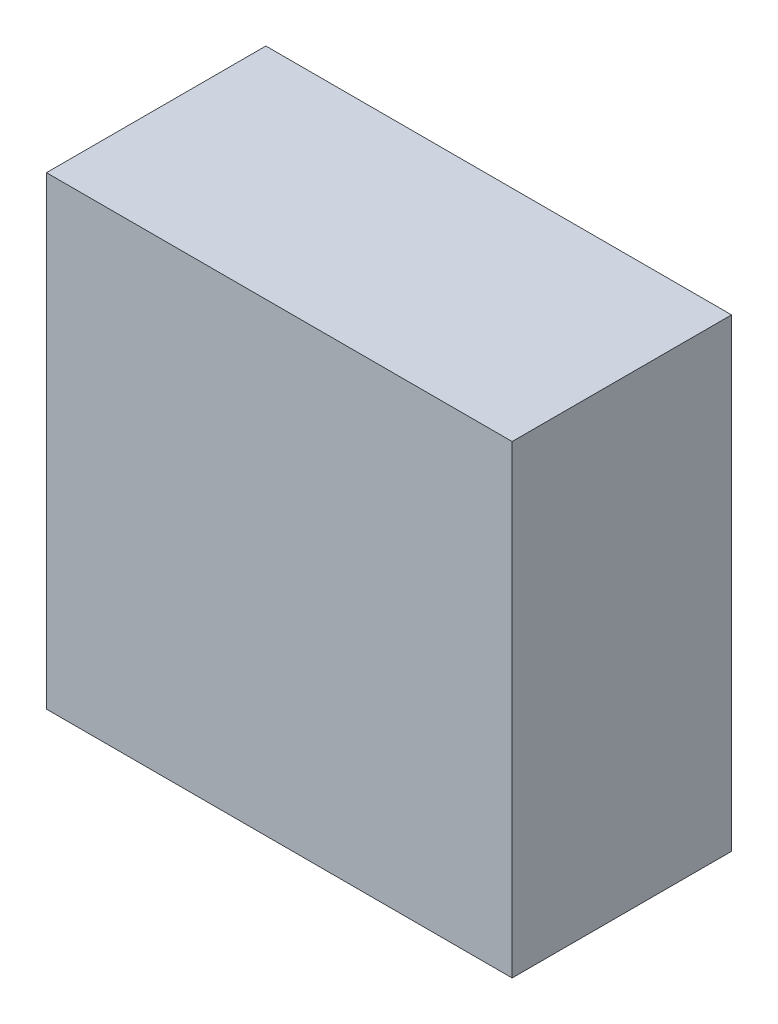
ISO-10303-21;
HEADER;
FILE_DESCRIPTION(('STEP AP214'),'2;1');
FILE_NAME('part.step','',(''),(''),'','','');
FILE_SCHEMA(('AUTOMOTIVE_DESIGN { 1 0 10303 214 1 1 1 1 }'));
ENDSEC;
DATA;
#1=APPLICATION_CONTEXT('core data for automotive mechanical design processes');
#2=APPLICATION_PROTOCOL_DEFINITION('international standard','automotive_design',2000,#1);
#3=PRODUCT_CONTEXT('',#1,'mechanical');
#4=PRODUCT('Part','Part','',(#3));
#5=PRODUCT_RELATED_PRODUCT_CATEGORY('part','',(#4));
#6=PRODUCT_DEFINITION_FORMATION('','',#4);
#7=PRODUCT_DEFINITION_CONTEXT('part definition',#1,'design');
#8=PRODUCT_DEFINITION('design','',#6,#7);
#9=PRODUCT_DEFINITION_SHAPE('','',#8);
#10=(LENGTH_UNIT() NAMED_UNIT(*) SI_UNIT(.MILLI.,.METRE.));
#11=(NAMED_UNIT(*) PLANE_ANGLE_UNIT() SI_UNIT($,.RADIAN.));
#12=(NAMED_UNIT(*) SI_UNIT($,.STERADIAN.) SOLID_ANGLE_UNIT());
#13=UNCERTAINTY_MEASURE_WITH_UNIT(LENGTH_MEASURE(1.E-05),#10,'distance_accuracy_value','');
#14=(GEOMETRIC_REPRESENTATION_CONTEXT(3) GLOBAL_UNCERTAINTY_ASSIGNED_CONTEXT((#13)) GLOBAL_UNIT_ASSIGNED_CONTEXT((#10,
#11,#12)) REPRESENTATION_CONTEXT('',''));
#15=CARTESIAN_POINT('',(0.,0.,0.));
#16=DIRECTION('',(0.,0.,1.));
#17=DIRECTION('',(1.,0.,0.));
#18=AXIS2_PLACEMENT_3D('',#15,#16,#17);
#19=CARTESIAN_POINT('',(-1.106566,-1.1016,1.));
#20=DIRECTION('',(1.,0.,0.));
#21=DIRECTION('',(0.,0.,-1.));
#22=AXIS2_PLACEMENT_3D('',#19,#20,#21);
#23=PLANE('',#22);
#24=DIRECTION('',(0.,-1.,0.));
#25=VECTOR('',#24,1.);
#26=CARTESIAN_POINT('',(-1.106566,-1.1016,0.));
#27=LINE('',#26,#25);
#28=CARTESIAN_POINT('',(-1.106566,1.016,0.));
#29=VERTEX_POINT('',#28);
#30=CARTESIAN_POINT('',(-1.106566,-1.1016,0.));
#31=VERTEX_POINT('',#30);
#32=EDGE_CURVE('E95',#29,#31,#27,.T.);
#33=ORIENTED_EDGE('',*,*,#32,.T.);
#34=DIRECTION('',(0.,0.,-1.));
#35=VECTOR('',#34,1.);
#36=CARTESIAN_POINT('',(-1.106566,-1.1016,1.));
#37=LINE('',#36,#35);
#38=CARTESIAN_POINT('',(-1.106566,-1.1016,1.));
#39=VERTEX_POINT('',#38);
#40=EDGE_CURVE('E11',#39,#31,#37,.T.);
#41=ORIENTED_EDGE('',*,*,#40,.F.);
#42=DIRECTION('',(0.,-1.,0.));
#43=VECTOR('',#42,1.);
#44=CARTESIAN_POINT('',(-1.106566,-1.1016,1.));
#45=LINE('',#44,#43);
#46=CARTESIAN_POINT('',(-1.106566,1.016,1.));
#47=VERTEX_POINT('',#46);
#48=EDGE_CURVE('E83',#47,#39,#45,.T.);
#49=ORIENTED_EDGE('',*,*,#48,.F.);
#50=DIRECTION('',(0.,0.,-1.));
#51=VECTOR('',#50,1.);
#52=CARTESIAN_POINT('',(-1.106566,1.016,1.));
#53=LINE('',#52,#51);
#54=EDGE_CURVE('E91',#47,#29,#53,.T.);
#55=ORIENTED_EDGE('',*,*,#54,.T.);
#56=EDGE_LOOP('',(#33,#41,#49,#55));
#57=FACE_BOUND('',#56,.T.);
#58=ADVANCED_FACE('F32',(#57),#23,.F.);
#59=CARTESIAN_POINT('',(1.016,-1.1016,1.));
#60=DIRECTION('',(0.,1.,0.));
#61=DIRECTION('',(0.,0.,1.));
#62=AXIS2_PLACEMENT_3D('',#59,#60,#61);
#63=PLANE('',#62);
#64=DIRECTION('',(1.,0.,0.));
#65=VECTOR('',#64,1.);
#66=CARTESIAN_POINT('',(1.016,-1.1016,0.));
#67=LINE('',#66,#65);
#68=CARTESIAN_POINT('',(1.016,-1.1016,0.));
#69=VERTEX_POINT('',#68);
#70=EDGE_CURVE('E87',#31,#69,#67,.T.);
#71=ORIENTED_EDGE('',*,*,#70,.T.);
#72=DIRECTION('',(0.,0.,-1.));
#73=VECTOR('',#72,1.);
#74=CARTESIAN_POINT('',(1.016,-1.1016,1.));
#75=LINE('',#74,#73);
#76=CARTESIAN_POINT('',(1.016,-1.1016,1.));
#77=VERTEX_POINT('',#76);
#78=EDGE_CURVE('E40',#77,#69,#75,.T.);
#79=ORIENTED_EDGE('',*,*,#78,.F.);
#80=DIRECTION('',(1.,0.,0.));
#81=VECTOR('',#80,1.);
#82=CARTESIAN_POINT('',(1.016,-1.1016,1.));
#83=LINE('',#82,#81);
#84=EDGE_CURVE('E78',#39,#77,#83,.T.);
#85=ORIENTED_EDGE('',*,*,#84,.F.);
#86=ORIENTED_EDGE('',*,*,#40,.T.);
#87=EDGE_LOOP('',(#71,#79,#85,#86));
#88=FACE_BOUND('',#87,.T.);
#89=ADVANCED_FACE('F86',(#88),#63,.F.);
#90=CARTESIAN_POINT('',(1.016,1.016,1.));
#91=DIRECTION('',(-1.,0.,0.));
#92=DIRECTION('',(0.,0.,1.));
#93=AXIS2_PLACEMENT_3D('',#90,#91,#92);
#94=PLANE('',#93);
#95=DIRECTION('',(0.,1.,0.));
#96=VECTOR('',#95,1.);
#97=CARTESIAN_POINT('',(1.016,1.016,0.));
#98=LINE('',#97,#96);
#99=CARTESIAN_POINT('',(1.016,1.016,0.));
#100=VERTEX_POINT('',#99);
#101=EDGE_CURVE('E65',#69,#100,#98,.T.);
#102=ORIENTED_EDGE('',*,*,#101,.T.);
#103=DIRECTION('',(0.,0.,-1.));
#104=VECTOR('',#103,1.);
#105=CARTESIAN_POINT('',(1.016,1.016,1.));
#106=LINE('',#105,#104);
#107=CARTESIAN_POINT('',(1.016,1.016,1.));
#108=VERTEX_POINT('',#107);
#109=EDGE_CURVE('E88',#108,#100,#106,.T.);
#110=ORIENTED_EDGE('',*,*,#109,.F.);
#111=DIRECTION('',(0.,1.,0.));
#112=VECTOR('',#111,1.);
#113=CARTESIAN_POINT('',(1.016,1.016,1.));
#114=LINE('',#113,#112);
#115=EDGE_CURVE('E81',#77,#108,#114,.T.);
#116=ORIENTED_EDGE('',*,*,#115,.F.);
#117=ORIENTED_EDGE('',*,*,#78,.T.);
#118=EDGE_LOOP('',(#102,#110,#116,#117));
#119=FACE_BOUND('',#118,.T.);
#120=ADVANCED_FACE('F89',(#119),#94,.F.);
#121=CARTESIAN_POINT('',(-1.106566,1.016,1.));
#122=DIRECTION('',(0.,-1.,0.));
#123=DIRECTION('',(0.,0.,-1.));
#124=AXIS2_PLACEMENT_3D('',#121,#122,#123);
#125=PLANE('',#124);
#126=DIRECTION('',(-1.,0.,0.));
#127=VECTOR('',#126,1.);
#128=CARTESIAN_POINT('',(-1.106566,1.016,0.));
#129=LINE('',#128,#127);
#130=EDGE_CURVE('E71',#100,#29,#129,.T.);
#131=ORIENTED_EDGE('',*,*,#130,.T.);
#132=ORIENTED_EDGE('',*,*,#54,.F.);
#133=DIRECTION('',(-1.,0.,0.));
#134=VECTOR('',#133,1.);
#135=CARTESIAN_POINT('',(-1.106566,1.016,1.));
#136=LINE('',#135,#134);
#137=EDGE_CURVE('E48',#108,#47,#136,.T.);
#138=ORIENTED_EDGE('',*,*,#137,.F.);
#139=ORIENTED_EDGE('',*,*,#109,.T.);
#140=EDGE_LOOP('',(#131,#132,#138,#139));
#141=FACE_BOUND('',#140,.T.);
#142=ADVANCED_FACE('F102',(#141),#125,.F.);
#143=CARTESIAN_POINT('',(0.,0.,1.));
#144=DIRECTION('',(0.,0.,-1.));
#145=DIRECTION('',(-1.,0.,0.));
#146=AXIS2_PLACEMENT_3D('',#143,#144,#145);
#147=PLANE('',#146);
#148=ORIENTED_EDGE('',*,*,#48,.T.);
#149=ORIENTED_EDGE('',*,*,#84,.T.);
#150=ORIENTED_EDGE('',*,*,#115,.T.);
#151=ORIENTED_EDGE('',*,*,#137,.T.);
#152=EDGE_LOOP('',(#148,#149,#150,#151));
#153=FACE_BOUND('',#152,.T.);
#154=ADVANCED_FACE('F79',(#153),#147,.F.);
#155=CARTESIAN_POINT('',(0.,0.,0.));
#156=DIRECTION('',(0.,0.,-1.));
#157=DIRECTION('',(-1.,0.,0.));
#158=AXIS2_PLACEMENT_3D('',#155,#156,#157);
#159=PLANE('',#158);
#160=ORIENTED_EDGE('',*,*,#32,.F.);
#161=ORIENTED_EDGE('',*,*,#130,.F.);
#162=ORIENTED_EDGE('',*,*,#101,.F.);
#163=ORIENTED_EDGE('',*,*,#70,.F.);
#164=EDGE_LOOP('',(#160,#161,#162,#163));
#165=FACE_BOUND('',#164,.T.);
#166=ADVANCED_FACE('F105',(#165),#159,.T.);
#167=CLOSED_SHELL('',(#58,#89,#120,#142,#154,#166));
#168=MANIFOLD_SOLID_BREP('B2',#167);
#169=ADVANCED_BREP_SHAPE_REPRESENTATION('',(#18,#168),#14);
#170=SHAPE_DEFINITION_REPRESENTATION(#9,#169);
ENDSEC;
END-ISO-10303-21;
